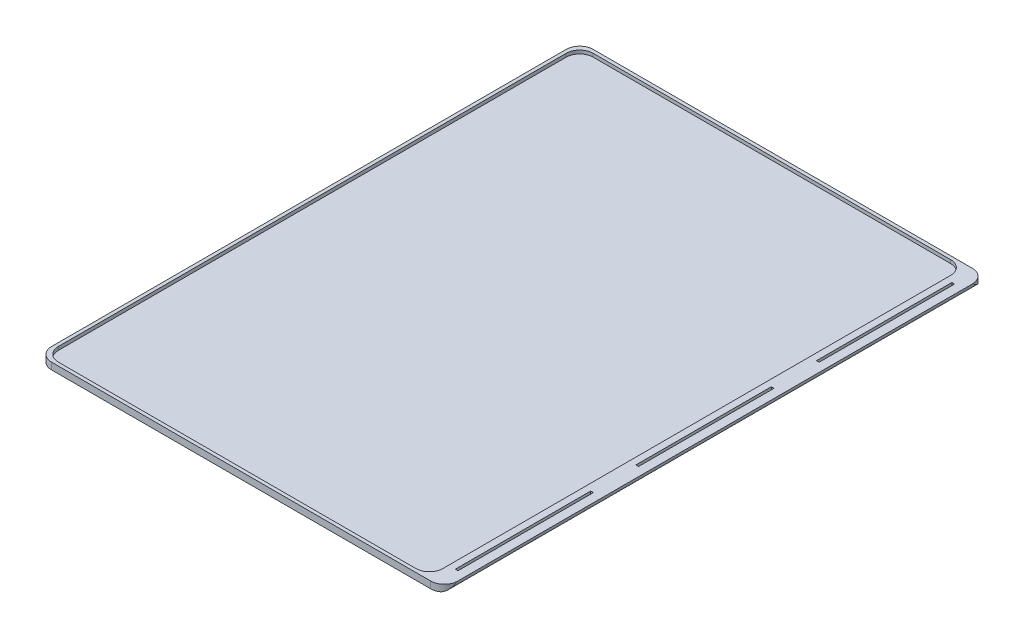
ISO-10303-21;
HEADER;
FILE_DESCRIPTION(('STEP AP214'),'2;1');
FILE_NAME('part.step','',(''),(''),'','','');
FILE_SCHEMA(('AUTOMOTIVE_DESIGN { 1 0 10303 214 1 1 1 1 }'));
ENDSEC;
DATA;
#1=APPLICATION_CONTEXT('core data for automotive mechanical design processes');
#2=APPLICATION_PROTOCOL_DEFINITION('international standard','automotive_design',2000,#1);
#3=PRODUCT_CONTEXT('',#1,'mechanical');
#4=PRODUCT('Part','Part','',(#3));
#5=PRODUCT_RELATED_PRODUCT_CATEGORY('part','',(#4));
#6=PRODUCT_DEFINITION_FORMATION('','',#4);
#7=PRODUCT_DEFINITION_CONTEXT('part definition',#1,'design');
#8=PRODUCT_DEFINITION('design','',#6,#7);
#9=PRODUCT_DEFINITION_SHAPE('','',#8);
#10=(LENGTH_UNIT() NAMED_UNIT(*) SI_UNIT(.MILLI.,.METRE.));
#11=(NAMED_UNIT(*) PLANE_ANGLE_UNIT() SI_UNIT($,.RADIAN.));
#12=(NAMED_UNIT(*) SI_UNIT($,.STERADIAN.) SOLID_ANGLE_UNIT());
#13=UNCERTAINTY_MEASURE_WITH_UNIT(LENGTH_MEASURE(1.E-05),#10,'distance_accuracy_value','');
#14=(GEOMETRIC_REPRESENTATION_CONTEXT(3) GLOBAL_UNCERTAINTY_ASSIGNED_CONTEXT((#13)) GLOBAL_UNIT_ASSIGNED_CONTEXT((#10,
#11,#12)) REPRESENTATION_CONTEXT('',''));
#15=CARTESIAN_POINT('',(0.,0.,0.));
#16=DIRECTION('',(0.,0.,1.));
#17=DIRECTION('',(1.,0.,0.));
#18=AXIS2_PLACEMENT_3D('',#15,#16,#17);
#19=CARTESIAN_POINT('',(-150.,5.,200.));
#20=DIRECTION('',(0.,0.,-1.));
#21=DIRECTION('',(-1.,0.,0.));
#22=AXIS2_PLACEMENT_3D('',#19,#20,#21);
#23=PLANE('',#22);
#24=DIRECTION('',(0.,1.,0.));
#25=VECTOR('',#24,1.);
#26=CARTESIAN_POINT('',(140.,0.,200.));
#27=LINE('',#26,#25);
#28=CARTESIAN_POINT('',(140.,0.,200.));
#29=VERTEX_POINT('',#28);
#30=CARTESIAN_POINT('',(140.,5.,200.));
#31=VERTEX_POINT('',#30);
#32=EDGE_CURVE('E81',#29,#31,#27,.T.);
#33=ORIENTED_EDGE('',*,*,#32,.T.);
#34=DIRECTION('',(1.,0.,0.));
#35=VECTOR('',#34,1.);
#36=CARTESIAN_POINT('',(-150.,5.,200.));
#37=LINE('',#36,#35);
#38=CARTESIAN_POINT('',(-140.,5.,200.));
#39=VERTEX_POINT('',#38);
#40=EDGE_CURVE('E239',#39,#31,#37,.T.);
#41=ORIENTED_EDGE('',*,*,#40,.F.);
#42=DIRECTION('',(0.,-1.,0.));
#43=VECTOR('',#42,1.);
#44=CARTESIAN_POINT('',(-140.,5.,200.));
#45=LINE('',#44,#43);
#46=CARTESIAN_POINT('',(-140.,0.,200.));
#47=VERTEX_POINT('',#46);
#48=EDGE_CURVE('E252',#39,#47,#45,.T.);
#49=ORIENTED_EDGE('',*,*,#48,.T.);
#50=DIRECTION('',(1.,0.,0.));
#51=VECTOR('',#50,1.);
#52=CARTESIAN_POINT('',(-150.,0.,200.));
#53=LINE('',#52,#51);
#54=EDGE_CURVE('E562',#47,#29,#53,.T.);
#55=ORIENTED_EDGE('',*,*,#54,.T.);
#56=EDGE_LOOP('',(#33,#41,#49,#55));
#57=FACE_BOUND('',#56,.T.);
#58=ADVANCED_FACE('F38',(#57),#23,.F.);
#59=CARTESIAN_POINT('',(-150.,5.,-200.));
#60=DIRECTION('',(0.,0.,1.));
#61=DIRECTION('',(1.,0.,0.));
#62=AXIS2_PLACEMENT_3D('',#59,#60,#61);
#63=PLANE('',#62);
#64=DIRECTION('',(-1.,0.,0.));
#65=VECTOR('',#64,1.);
#66=CARTESIAN_POINT('',(-150.,5.,-200.));
#67=LINE('',#66,#65);
#68=CARTESIAN_POINT('',(140.,5.,-200.));
#69=VERTEX_POINT('',#68);
#70=CARTESIAN_POINT('',(-140.,5.,-200.));
#71=VERTEX_POINT('',#70);
#72=EDGE_CURVE('E561',#69,#71,#67,.T.);
#73=ORIENTED_EDGE('',*,*,#72,.F.);
#74=DIRECTION('',(0.,1.,0.));
#75=VECTOR('',#74,1.);
#76=CARTESIAN_POINT('',(140.,0.,-200.));
#77=LINE('',#76,#75);
#78=CARTESIAN_POINT('',(140.,0.,-200.));
#79=VERTEX_POINT('',#78);
#80=EDGE_CURVE('E75',#79,#69,#77,.T.);
#81=ORIENTED_EDGE('',*,*,#80,.F.);
#82=DIRECTION('',(-1.,0.,0.));
#83=VECTOR('',#82,1.);
#84=CARTESIAN_POINT('',(-150.,0.,-200.));
#85=LINE('',#84,#83);
#86=CARTESIAN_POINT('',(-140.,0.,-200.));
#87=VERTEX_POINT('',#86);
#88=EDGE_CURVE('E557',#79,#87,#85,.T.);
#89=ORIENTED_EDGE('',*,*,#88,.T.);
#90=DIRECTION('',(0.,-1.,0.));
#91=VECTOR('',#90,1.);
#92=CARTESIAN_POINT('',(-140.,5.,-200.));
#93=LINE('',#92,#91);
#94=EDGE_CURVE('E379',#87,#71,#93,.F.);
#95=ORIENTED_EDGE('',*,*,#94,.T.);
#96=EDGE_LOOP('',(#73,#81,#89,#95));
#97=FACE_BOUND('',#96,.T.);
#98=ADVANCED_FACE('F311',(#97),#63,.F.);
#99=CARTESIAN_POINT('',(-150.,5.,200.));
#100=DIRECTION('',(1.,0.,0.));
#101=DIRECTION('',(0.,0.,-1.));
#102=AXIS2_PLACEMENT_3D('',#99,#100,#101);
#103=PLANE('',#102);
#104=DIRECTION('',(0.,0.,1.));
#105=VECTOR('',#104,1.);
#106=CARTESIAN_POINT('',(-150.,5.,200.));
#107=LINE('',#106,#105);
#108=CARTESIAN_POINT('',(-150.,5.,-190.));
#109=VERTEX_POINT('',#108);
#110=CARTESIAN_POINT('',(-150.,5.,190.));
#111=VERTEX_POINT('',#110);
#112=EDGE_CURVE('E241',#109,#111,#107,.T.);
#113=ORIENTED_EDGE('',*,*,#112,.F.);
#114=DIRECTION('',(0.,-1.,0.));
#115=VECTOR('',#114,1.);
#116=CARTESIAN_POINT('',(-150.,5.,-190.));
#117=LINE('',#116,#115);
#118=CARTESIAN_POINT('',(-150.,0.,-190.));
#119=VERTEX_POINT('',#118);
#120=EDGE_CURVE('E369',#109,#119,#117,.T.);
#121=ORIENTED_EDGE('',*,*,#120,.T.);
#122=DIRECTION('',(0.,0.,1.));
#123=VECTOR('',#122,1.);
#124=CARTESIAN_POINT('',(-150.,0.,200.));
#125=LINE('',#124,#123);
#126=CARTESIAN_POINT('',(-150.,0.,190.));
#127=VERTEX_POINT('',#126);
#128=EDGE_CURVE('E569',#119,#127,#125,.T.);
#129=ORIENTED_EDGE('',*,*,#128,.T.);
#130=DIRECTION('',(0.,-1.,0.));
#131=VECTOR('',#130,1.);
#132=CARTESIAN_POINT('',(-150.,5.,190.));
#133=LINE('',#132,#131);
#134=EDGE_CURVE('E366',#127,#111,#133,.F.);
#135=ORIENTED_EDGE('',*,*,#134,.T.);
#136=EDGE_LOOP('',(#113,#121,#129,#135));
#137=FACE_BOUND('',#136,.T.);
#138=ADVANCED_FACE('F305',(#137),#103,.F.);
#139=CARTESIAN_POINT('',(0.,5.,0.));
#140=DIRECTION('',(0.,-1.,0.));
#141=DIRECTION('',(0.,0.,-1.));
#142=AXIS2_PLACEMENT_3D('',#139,#140,#141);
#143=PLANE('',#142);
#144=DIRECTION('',(-1.,0.,0.));
#145=VECTOR('',#144,1.);
#146=CARTESIAN_POINT('',(-147.5,5.,-197.5));
#147=LINE('',#146,#145);
#148=CARTESIAN_POINT('',(126.5,5.,-197.5));
#149=VERTEX_POINT('',#148);
#150=CARTESIAN_POINT('',(-137.5,5.,-197.5));
#151=VERTEX_POINT('',#150);
#152=EDGE_CURVE('E408',#149,#151,#147,.T.);
#153=ORIENTED_EDGE('',*,*,#152,.F.);
#154=CARTESIAN_POINT('',(126.5,5.,-187.5));
#155=DIRECTION('',(0.,-1.,0.));
#156=DIRECTION('',(0.,0.,-1.));
#157=AXIS2_PLACEMENT_3D('',#154,#155,#156);
#158=CIRCLE('',#157,10.);
#159=CARTESIAN_POINT('',(136.5,5.,-187.5));
#160=VERTEX_POINT('',#159);
#161=EDGE_CURVE('E264',#149,#160,#158,.T.);
#162=ORIENTED_EDGE('',*,*,#161,.T.);
#163=DIRECTION('',(0.,0.,-1.));
#164=VECTOR('',#163,1.);
#165=CARTESIAN_POINT('',(136.5,5.,197.5));
#166=LINE('',#165,#164);
#167=CARTESIAN_POINT('',(136.5,5.,187.5));
#168=VERTEX_POINT('',#167);
#169=EDGE_CURVE('E592',#168,#160,#166,.T.);
#170=ORIENTED_EDGE('',*,*,#169,.F.);
#171=CARTESIAN_POINT('',(126.5,5.,187.5));
#172=DIRECTION('',(0.,-1.,0.));
#173=DIRECTION('',(0.,0.,-1.));
#174=AXIS2_PLACEMENT_3D('',#171,#172,#173);
#175=CIRCLE('',#174,10.);
#176=CARTESIAN_POINT('',(126.5,5.,197.5));
#177=VERTEX_POINT('',#176);
#178=EDGE_CURVE('E227',#168,#177,#175,.T.);
#179=ORIENTED_EDGE('',*,*,#178,.T.);
#180=DIRECTION('',(1.,0.,0.));
#181=VECTOR('',#180,1.);
#182=CARTESIAN_POINT('',(-147.5,5.,197.5));
#183=LINE('',#182,#181);
#184=CARTESIAN_POINT('',(-137.5,5.,197.5));
#185=VERTEX_POINT('',#184);
#186=EDGE_CURVE('E392',#185,#177,#183,.T.);
#187=ORIENTED_EDGE('',*,*,#186,.F.);
#188=CARTESIAN_POINT('',(-137.5,5.,187.5));
#189=DIRECTION('',(0.,-1.,0.));
#190=DIRECTION('',(0.,0.,-1.));
#191=AXIS2_PLACEMENT_3D('',#188,#189,#190);
#192=CIRCLE('',#191,10.);
#193=CARTESIAN_POINT('',(-147.5,5.,187.5));
#194=VERTEX_POINT('',#193);
#195=EDGE_CURVE('E247',#185,#194,#192,.T.);
#196=ORIENTED_EDGE('',*,*,#195,.T.);
#197=DIRECTION('',(0.,0.,1.));
#198=VECTOR('',#197,1.);
#199=CARTESIAN_POINT('',(-147.5,5.,197.5));
#200=LINE('',#199,#198);
#201=CARTESIAN_POINT('',(-147.5,5.,-187.5));
#202=VERTEX_POINT('',#201);
#203=EDGE_CURVE('E401',#202,#194,#200,.T.);
#204=ORIENTED_EDGE('',*,*,#203,.F.);
#205=CARTESIAN_POINT('',(-137.5,5.,-187.5));
#206=DIRECTION('',(0.,-1.,0.));
#207=DIRECTION('',(0.,0.,-1.));
#208=AXIS2_PLACEMENT_3D('',#205,#206,#207);
#209=CIRCLE('',#208,10.);
#210=EDGE_CURVE('E259',#202,#151,#209,.T.);
#211=ORIENTED_EDGE('',*,*,#210,.T.);
#212=EDGE_LOOP('',(#153,#162,#170,#179,#187,#196,#204,#211));
#213=FACE_BOUND('',#212,.T.);
#214=DIRECTION('',(-1.,0.,0.));
#215=VECTOR('',#214,1.);
#216=CARTESIAN_POINT('',(0.,5.,-83.3333333333333));
#217=LINE('',#216,#215);
#218=CARTESIAN_POINT('',(143.5,5.,-83.3333333333333));
#219=VERTEX_POINT('',#218);
#220=CARTESIAN_POINT('',(141.5,5.,-83.3333333333333));
#221=VERTEX_POINT('',#220);
#222=EDGE_CURVE('E537',#219,#221,#217,.T.);
#223=ORIENTED_EDGE('',*,*,#222,.T.);
#224=DIRECTION('',(0.,0.,-1.));
#225=VECTOR('',#224,1.);
#226=CARTESIAN_POINT('',(141.5,5.,0.));
#227=LINE('',#226,#225);
#228=CARTESIAN_POINT('',(141.5,5.,-183.333333333333));
#229=VERTEX_POINT('',#228);
#230=EDGE_CURVE('E549',#221,#229,#227,.T.);
#231=ORIENTED_EDGE('',*,*,#230,.T.);
#232=DIRECTION('',(1.,0.,0.));
#233=VECTOR('',#232,1.);
#234=CARTESIAN_POINT('',(0.,5.,-183.333333333333));
#235=LINE('',#234,#233);
#236=CARTESIAN_POINT('',(143.5,5.,-183.333333333333));
#237=VERTEX_POINT('',#236);
#238=EDGE_CURVE('E545',#229,#237,#235,.T.);
#239=ORIENTED_EDGE('',*,*,#238,.T.);
#240=DIRECTION('',(0.,0.,1.));
#241=VECTOR('',#240,1.);
#242=CARTESIAN_POINT('',(143.5,5.,0.));
#243=LINE('',#242,#241);
#244=EDGE_CURVE('E541',#237,#219,#243,.T.);
#245=ORIENTED_EDGE('',*,*,#244,.T.);
#246=EDGE_LOOP('',(#223,#231,#239,#245));
#247=FACE_BOUND('',#246,.T.);
#248=DIRECTION('',(1.,0.,0.));
#249=VECTOR('',#248,1.);
#250=CARTESIAN_POINT('',(0.,5.,83.3333333333333));
#251=LINE('',#250,#249);
#252=CARTESIAN_POINT('',(141.5,5.,83.3333333333333));
#253=VERTEX_POINT('',#252);
#254=CARTESIAN_POINT('',(143.5,5.,83.3333333333333));
#255=VERTEX_POINT('',#254);
#256=EDGE_CURVE('E521',#253,#255,#251,.T.);
#257=ORIENTED_EDGE('',*,*,#256,.T.);
#258=DIRECTION('',(0.,0.,1.));
#259=VECTOR('',#258,1.);
#260=CARTESIAN_POINT('',(143.5,5.,0.));
#261=LINE('',#260,#259);
#262=CARTESIAN_POINT('',(143.5,5.,183.333333333333));
#263=VERTEX_POINT('',#262);
#264=EDGE_CURVE('E533',#255,#263,#261,.T.);
#265=ORIENTED_EDGE('',*,*,#264,.T.);
#266=DIRECTION('',(-1.,0.,0.));
#267=VECTOR('',#266,1.);
#268=CARTESIAN_POINT('',(0.,5.,183.333333333333));
#269=LINE('',#268,#267);
#270=CARTESIAN_POINT('',(141.5,5.,183.333333333333));
#271=VERTEX_POINT('',#270);
#272=EDGE_CURVE('E529',#263,#271,#269,.T.);
#273=ORIENTED_EDGE('',*,*,#272,.T.);
#274=DIRECTION('',(0.,0.,-1.));
#275=VECTOR('',#274,1.);
#276=CARTESIAN_POINT('',(141.5,5.,0.));
#277=LINE('',#276,#275);
#278=EDGE_CURVE('E525',#271,#253,#277,.T.);
#279=ORIENTED_EDGE('',*,*,#278,.T.);
#280=EDGE_LOOP('',(#257,#265,#273,#279));
#281=FACE_BOUND('',#280,.T.);
#282=DIRECTION('',(1.,0.,0.));
#283=VECTOR('',#282,1.);
#284=CARTESIAN_POINT('',(0.,5.,-50.));
#285=LINE('',#284,#283);
#286=CARTESIAN_POINT('',(141.5,5.,-50.));
#287=VERTEX_POINT('',#286);
#288=CARTESIAN_POINT('',(143.5,5.,-50.));
#289=VERTEX_POINT('',#288);
#290=EDGE_CURVE('E495',#287,#289,#285,.T.);
#291=ORIENTED_EDGE('',*,*,#290,.T.);
#292=DIRECTION('',(0.,0.,1.));
#293=VECTOR('',#292,1.);
#294=CARTESIAN_POINT('',(143.5,5.,0.));
#295=LINE('',#294,#293);
#296=CARTESIAN_POINT('',(143.5,5.,50.));
#297=VERTEX_POINT('',#296);
#298=EDGE_CURVE('E517',#289,#297,#295,.T.);
#299=ORIENTED_EDGE('',*,*,#298,.T.);
#300=DIRECTION('',(-1.,0.,0.));
#301=VECTOR('',#300,1.);
#302=CARTESIAN_POINT('',(0.,5.,50.));
#303=LINE('',#302,#301);
#304=CARTESIAN_POINT('',(141.5,5.,50.));
#305=VERTEX_POINT('',#304);
#306=EDGE_CURVE('E513',#297,#305,#303,.T.);
#307=ORIENTED_EDGE('',*,*,#306,.T.);
#308=DIRECTION('',(0.,0.,-1.));
#309=VECTOR('',#308,1.);
#310=CARTESIAN_POINT('',(141.5,5.,0.));
#311=LINE('',#310,#309);
#312=EDGE_CURVE('E509',#305,#287,#311,.T.);
#313=ORIENTED_EDGE('',*,*,#312,.T.);
#314=EDGE_LOOP('',(#291,#299,#307,#313));
#315=FACE_BOUND('',#314,.T.);
#316=DIRECTION('',(0.,0.,-1.));
#317=VECTOR('',#316,1.);
#318=CARTESIAN_POINT('',(150.,5.,200.));
#319=LINE('',#318,#317);
#320=CARTESIAN_POINT('',(150.,5.,190.));
#321=VERTEX_POINT('',#320);
#322=CARTESIAN_POINT('',(150.,5.,-190.));
#323=VERTEX_POINT('',#322);
#324=EDGE_CURVE('E558',#321,#323,#319,.T.);
#325=ORIENTED_EDGE('',*,*,#324,.T.);
#326=CARTESIAN_POINT('',(140.,5.,-190.));
#327=DIRECTION('',(0.,1.,0.));
#328=DIRECTION('',(0.,0.,1.));
#329=AXIS2_PLACEMENT_3D('',#326,#327,#328);
#330=CIRCLE('',#329,10.);
#331=EDGE_CURVE('E42',#69,#323,#330,.F.);
#332=ORIENTED_EDGE('',*,*,#331,.F.);
#333=ORIENTED_EDGE('',*,*,#72,.T.);
#334=CARTESIAN_POINT('',(-140.,5.,-190.));
#335=DIRECTION('',(0.,-1.,0.));
#336=DIRECTION('',(0.,0.,-1.));
#337=AXIS2_PLACEMENT_3D('',#334,#335,#336);
#338=CIRCLE('',#337,10.);
#339=EDGE_CURVE('E246',#71,#109,#338,.F.);
#340=ORIENTED_EDGE('',*,*,#339,.T.);
#341=ORIENTED_EDGE('',*,*,#112,.T.);
#342=CARTESIAN_POINT('',(-140.,5.,190.));
#343=DIRECTION('',(0.,-1.,0.));
#344=DIRECTION('',(0.,0.,-1.));
#345=AXIS2_PLACEMENT_3D('',#342,#343,#344);
#346=CIRCLE('',#345,10.);
#347=EDGE_CURVE('E234',#111,#39,#346,.F.);
#348=ORIENTED_EDGE('',*,*,#347,.T.);
#349=ORIENTED_EDGE('',*,*,#40,.T.);
#350=CARTESIAN_POINT('',(140.,5.,190.));
#351=DIRECTION('',(0.,1.,0.));
#352=DIRECTION('',(0.,0.,1.));
#353=AXIS2_PLACEMENT_3D('',#350,#351,#352);
#354=CIRCLE('',#353,10.);
#355=EDGE_CURVE('E610',#321,#31,#354,.F.);
#356=ORIENTED_EDGE('',*,*,#355,.F.);
#357=EDGE_LOOP('',(#325,#332,#333,#340,#341,#348,#349,#356));
#358=FACE_BOUND('',#357,.T.);
#359=ADVANCED_FACE('F237',(#213,#247,#281,#315,#358),#143,.F.);
#360=CARTESIAN_POINT('',(0.,0.,0.));
#361=DIRECTION('',(0.,-1.,0.));
#362=DIRECTION('',(0.,0.,-1.));
#363=AXIS2_PLACEMENT_3D('',#360,#361,#362);
#364=PLANE('',#363);
#365=CARTESIAN_POINT('',(140.,0.,-190.));
#366=DIRECTION('',(0.,-1.,0.));
#367=DIRECTION('',(0.,0.,-1.));
#368=AXIS2_PLACEMENT_3D('',#365,#366,#367);
#369=CIRCLE('',#368,10.);
#370=CARTESIAN_POINT('',(145.,0.,-198.660254037844));
#371=VERTEX_POINT('',#370);
#372=EDGE_CURVE('E605',#79,#371,#369,.T.);
#373=ORIENTED_EDGE('',*,*,#372,.T.);
#374=DIRECTION('',(0.,0.,1.));
#375=VECTOR('',#374,1.);
#376=CARTESIAN_POINT('',(145.,0.,-207.071067811865));
#377=LINE('',#376,#375);
#378=CARTESIAN_POINT('',(145.,0.,198.660254037844));
#379=VERTEX_POINT('',#378);
#380=EDGE_CURVE('E553',#371,#379,#377,.T.);
#381=ORIENTED_EDGE('',*,*,#380,.T.);
#382=CARTESIAN_POINT('',(140.,0.,190.));
#383=DIRECTION('',(0.,-1.,0.));
#384=DIRECTION('',(0.,0.,1.));
#385=AXIS2_PLACEMENT_3D('',#382,#383,#384);
#386=CIRCLE('',#385,10.);
#387=EDGE_CURVE('E57',#379,#29,#386,.T.);
#388=ORIENTED_EDGE('',*,*,#387,.T.);
#389=ORIENTED_EDGE('',*,*,#54,.F.);
#390=CARTESIAN_POINT('',(-140.,0.,190.));
#391=DIRECTION('',(0.,-1.,0.));
#392=DIRECTION('',(0.,0.,-1.));
#393=AXIS2_PLACEMENT_3D('',#390,#391,#392);
#394=CIRCLE('',#393,10.);
#395=EDGE_CURVE('E257',#47,#127,#394,.T.);
#396=ORIENTED_EDGE('',*,*,#395,.T.);
#397=ORIENTED_EDGE('',*,*,#128,.F.);
#398=CARTESIAN_POINT('',(-140.,0.,-190.));
#399=DIRECTION('',(0.,-1.,0.));
#400=DIRECTION('',(0.,0.,-1.));
#401=AXIS2_PLACEMENT_3D('',#398,#399,#400);
#402=CIRCLE('',#401,10.);
#403=EDGE_CURVE('E375',#119,#87,#402,.T.);
#404=ORIENTED_EDGE('',*,*,#403,.T.);
#405=ORIENTED_EDGE('',*,*,#88,.F.);
#406=EDGE_LOOP('',(#373,#381,#388,#389,#396,#397,#404,#405));
#407=FACE_BOUND('',#406,.T.);
#408=DIRECTION('',(0.,0.,1.));
#409=VECTOR('',#408,1.);
#410=CARTESIAN_POINT('',(141.5,0.,-83.3333333333333));
#411=LINE('',#410,#409);
#412=CARTESIAN_POINT('',(141.5,0.,-183.333333333333));
#413=VERTEX_POINT('',#412);
#414=CARTESIAN_POINT('',(141.5,0.,-83.3333333333333));
#415=VERTEX_POINT('',#414);
#416=EDGE_CURVE('E445',#413,#415,#411,.T.);
#417=ORIENTED_EDGE('',*,*,#416,.T.);
#418=DIRECTION('',(1.,0.,0.));
#419=VECTOR('',#418,1.);
#420=CARTESIAN_POINT('',(143.5,0.,-83.3333333333333));
#421=LINE('',#420,#419);
#422=CARTESIAN_POINT('',(143.5,0.,-83.3333333333333));
#423=VERTEX_POINT('',#422);
#424=EDGE_CURVE('E449',#415,#423,#421,.T.);
#425=ORIENTED_EDGE('',*,*,#424,.T.);
#426=DIRECTION('',(0.,0.,-1.));
#427=VECTOR('',#426,1.);
#428=CARTESIAN_POINT('',(143.5,0.,-83.3333333333333));
#429=LINE('',#428,#427);
#430=CARTESIAN_POINT('',(143.5,0.,-183.333333333333));
#431=VERTEX_POINT('',#430);
#432=EDGE_CURVE('E453',#423,#431,#429,.T.);
#433=ORIENTED_EDGE('',*,*,#432,.T.);
#434=DIRECTION('',(-1.,0.,0.));
#435=VECTOR('',#434,1.);
#436=CARTESIAN_POINT('',(143.5,0.,-183.333333333333));
#437=LINE('',#436,#435);
#438=EDGE_CURVE('E457',#431,#413,#437,.T.);
#439=ORIENTED_EDGE('',*,*,#438,.T.);
#440=EDGE_LOOP('',(#417,#425,#433,#439));
#441=FACE_BOUND('',#440,.T.);
#442=DIRECTION('',(0.,0.,-1.));
#443=VECTOR('',#442,1.);
#444=CARTESIAN_POINT('',(143.5,0.,83.3333333333333));
#445=LINE('',#444,#443);
#446=CARTESIAN_POINT('',(143.5,0.,183.333333333333));
#447=VERTEX_POINT('',#446);
#448=CARTESIAN_POINT('',(143.5,0.,83.3333333333333));
#449=VERTEX_POINT('',#448);
#450=EDGE_CURVE('E412',#447,#449,#445,.T.);
#451=ORIENTED_EDGE('',*,*,#450,.T.);
#452=DIRECTION('',(-1.,0.,0.));
#453=VECTOR('',#452,1.);
#454=CARTESIAN_POINT('',(143.5,0.,83.3333333333333));
#455=LINE('',#454,#453);
#456=CARTESIAN_POINT('',(141.5,0.,83.3333333333333));
#457=VERTEX_POINT('',#456);
#458=EDGE_CURVE('E416',#449,#457,#455,.T.);
#459=ORIENTED_EDGE('',*,*,#458,.T.);
#460=DIRECTION('',(0.,0.,1.));
#461=VECTOR('',#460,1.);
#462=CARTESIAN_POINT('',(141.5,0.,83.3333333333333));
#463=LINE('',#462,#461);
#464=CARTESIAN_POINT('',(141.5,0.,183.333333333333));
#465=VERTEX_POINT('',#464);
#466=EDGE_CURVE('E421',#457,#465,#463,.T.);
#467=ORIENTED_EDGE('',*,*,#466,.T.);
#468=DIRECTION('',(1.,0.,0.));
#469=VECTOR('',#468,1.);
#470=CARTESIAN_POINT('',(143.5,0.,183.333333333333));
#471=LINE('',#470,#469);
#472=EDGE_CURVE('E425',#465,#447,#471,.T.);
#473=ORIENTED_EDGE('',*,*,#472,.T.);
#474=EDGE_LOOP('',(#451,#459,#467,#473));
#475=FACE_BOUND('',#474,.T.);
#476=DIRECTION('',(0.,0.,-1.));
#477=VECTOR('',#476,1.);
#478=CARTESIAN_POINT('',(143.5,0.,50.));
#479=LINE('',#478,#477);
#480=CARTESIAN_POINT('',(143.5,0.,50.));
#481=VERTEX_POINT('',#480);
#482=CARTESIAN_POINT('',(143.5,0.,-50.));
#483=VERTEX_POINT('',#482);
#484=EDGE_CURVE('E434',#481,#483,#479,.T.);
#485=ORIENTED_EDGE('',*,*,#484,.T.);
#486=DIRECTION('',(-1.,0.,0.));
#487=VECTOR('',#486,1.);
#488=CARTESIAN_POINT('',(141.5,0.,-50.));
#489=LINE('',#488,#487);
#490=CARTESIAN_POINT('',(141.5,0.,-50.));
#491=VERTEX_POINT('',#490);
#492=EDGE_CURVE('E478',#483,#491,#489,.T.);
#493=ORIENTED_EDGE('',*,*,#492,.T.);
#494=DIRECTION('',(0.,0.,1.));
#495=VECTOR('',#494,1.);
#496=CARTESIAN_POINT('',(141.5,0.,50.));
#497=LINE('',#496,#495);
#498=CARTESIAN_POINT('',(141.5,0.,50.));
#499=VERTEX_POINT('',#498);
#500=EDGE_CURVE('E482',#491,#499,#497,.T.);
#501=ORIENTED_EDGE('',*,*,#500,.T.);
#502=DIRECTION('',(1.,0.,0.));
#503=VECTOR('',#502,1.);
#504=CARTESIAN_POINT('',(141.5,0.,50.));
#505=LINE('',#504,#503);
#506=EDGE_CURVE('E486',#499,#481,#505,.T.);
#507=ORIENTED_EDGE('',*,*,#506,.T.);
#508=EDGE_LOOP('',(#485,#493,#501,#507));
#509=FACE_BOUND('',#508,.T.);
#510=ADVANCED_FACE('F299',(#407,#441,#475,#509),#364,.T.);
#511=CARTESIAN_POINT('',(145.,5.,-207.071067811865));
#512=DIRECTION('',(0.,0.,1.));
#513=DIRECTION('',(1.,0.,0.));
#514=AXIS2_PLACEMENT_3D('',#511,#512,#513);
#515=CYLINDRICAL_SURFACE('',#514,5.);
#516=ORIENTED_EDGE('',*,*,#380,.F.);
#517=CARTESIAN_POINT('',(145.,0.,-198.660254037844));
#518=CARTESIAN_POINT('',(145.093609803985,2.82900776375615E-07,-198.606212007458));
#519=CARTESIAN_POINT('',(145.186311264449,0.00262887455136164,-198.550662954952));
#520=CARTESIAN_POINT('',(145.36964138603,0.0128372529330054,-198.436740132321));
#521=CARTESIAN_POINT('',(145.460270761163,0.0204153066888389,-198.378367357499));
#522=CARTESIAN_POINT('',(145.728272440389,0.0500643550123252,-198.199566980871));
#523=CARTESIAN_POINT('',(145.902274960932,0.0790536521328677,-198.075158543872));
#524=CARTESIAN_POINT('',(146.237507498331,0.152561857671383,-197.819044434756));
#525=CARTESIAN_POINT('',(146.398876166368,0.19686998153993,-197.687457245508));
#526=CARTESIAN_POINT('',(146.710806798773,0.298927164585177,-197.416721400865));
#527=CARTESIAN_POINT('',(146.861360705299,0.356686112509046,-197.277567240372));
#528=CARTESIAN_POINT('',(147.178776996639,0.495735220903303,-196.965888284656));
#529=CARTESIAN_POINT('',(147.343298693685,0.579411379535737,-196.792048586878));
#530=CARTESIAN_POINT('',(147.656318748926,0.760113724235766,-196.437141735185));
#531=CARTESIAN_POINT('',(147.804816764136,0.857140195964682,-196.256074426678));
#532=CARTESIAN_POINT('',(148.086845991203,1.06274155527054,-195.887032941535));
#533=CARTESIAN_POINT('',(148.220288543533,1.17137818980302,-195.699025709427));
#534=CARTESIAN_POINT('',(148.471670665722,1.39776170220441,-195.31816530131));
#535=CARTESIAN_POINT('',(148.58960569155,1.51551123435892,-195.125310724559));
#536=CARTESIAN_POINT('',(148.855158632255,1.80766922049536,-194.656735938183));
#537=CARTESIAN_POINT('',(148.995441039513,1.98570315103982,-194.379102363274));
#538=CARTESIAN_POINT('',(149.247514860227,2.35270007359222,-193.818126441812));
#539=CARTESIAN_POINT('',(149.35929348694,2.54166792406395,-193.534781594477));
#540=CARTESIAN_POINT('',(149.555241292463,2.92720972137607,-192.964477925597));
#541=CARTESIAN_POINT('',(149.639451802214,3.12377178346134,-192.677525190093));
#542=CARTESIAN_POINT('',(149.781306053329,3.52222740575528,-192.100985491777));
#543=CARTESIAN_POINT('',(149.838961233289,3.72411863075196,-191.811399718053));
#544=CARTESIAN_POINT('',(149.922137945499,4.10291579740512,-191.27090816212));
#545=CARTESIAN_POINT('',(149.951008549531,4.27940080098434,-191.02021175129));
#546=CARTESIAN_POINT('',(149.989717957205,4.63342093770946,-190.518432616014));
#547=CARTESIAN_POINT('',(149.999576815702,4.81095476590358,-190.267350578567));
#548=CARTESIAN_POINT('',(149.999995554205,4.99230201707942,-190.010886592107));
#549=CARTESIAN_POINT('',(149.999999998529,4.99615102023748,-190.005443279649));
#550=CARTESIAN_POINT('',(150.,5.,-190.));
#551=B_SPLINE_CURVE_WITH_KNOTS('',3,(#517,#518,#519,#520,#521,#522,#523,#524,#525,#526,#527,
#528,#529,#530,#531,#532,#533,#534,#535,#536,#537,#538,#539,#540,#541,#542,#543,#544,#545,#546,
#547,#548,#549,#550),.UNSPECIFIED.,.F.,.F.,(4,2,2,2,2,2,2,2,2,2,2,2,2,2,2,2,4),(0.,
0.324164501699216,0.648215563170107,1.29453690515239,1.93229735394234,2.57052815854182,
3.3300899276727,4.08966795194073,4.8535082233837,5.61757181965431,6.69122947966733,
7.7653679365691,8.83788855857119,9.90994676377598,10.8332249647611,11.7555286965104,
11.7755287009549),.UNSPECIFIED.);
#552=EDGE_CURVE('E11',#371,#323,#551,.T.);
#553=ORIENTED_EDGE('',*,*,#552,.T.);
#554=ORIENTED_EDGE('',*,*,#324,.F.);
#555=CARTESIAN_POINT('',(145.,0.,198.660254037844));
#556=CARTESIAN_POINT('',(145.093609803985,2.82900775810247E-07,198.606212007458));
#557=CARTESIAN_POINT('',(145.186311264449,0.00262887455136094,198.550662954952));
#558=CARTESIAN_POINT('',(145.36964138603,0.0128372529330039,198.436740132321));
#559=CARTESIAN_POINT('',(145.460270761163,0.020415306688837,198.378367357499));
#560=CARTESIAN_POINT('',(145.728272440389,0.0500643550123212,198.199566980871));
#561=CARTESIAN_POINT('',(145.902274960932,0.0790536521328612,198.075158543872));
#562=CARTESIAN_POINT('',(146.237507498331,0.152561857671376,197.819044434756));
#563=CARTESIAN_POINT('',(146.398876166368,0.196869981539926,197.687457245508));
#564=CARTESIAN_POINT('',(146.710806798773,0.298927164585177,197.416721400865));
#565=CARTESIAN_POINT('',(146.861360705299,0.356686112509047,197.277567240372));
#566=CARTESIAN_POINT('',(147.178776996639,0.495735220903303,196.965888284656));
#567=CARTESIAN_POINT('',(147.343298693685,0.579411379535736,196.792048586878));
#568=CARTESIAN_POINT('',(147.656318748926,0.760113724235769,196.437141735185));
#569=CARTESIAN_POINT('',(147.804816764136,0.857140195964692,196.256074426678));
#570=CARTESIAN_POINT('',(148.086845991203,1.06274155527056,195.887032941535));
#571=CARTESIAN_POINT('',(148.220288543533,1.17137818980304,195.699025709427));
#572=CARTESIAN_POINT('',(148.471670665723,1.39776170220443,195.31816530131));
#573=CARTESIAN_POINT('',(148.58960569155,1.51551123435894,195.125310724559));
#574=CARTESIAN_POINT('',(148.855158632255,1.80766922049539,194.656735938183));
#575=CARTESIAN_POINT('',(148.995441039513,1.98570315103984,194.379102363274));
#576=CARTESIAN_POINT('',(149.247514860227,2.35270007359223,193.818126441812));
#577=CARTESIAN_POINT('',(149.35929348694,2.54166792406395,193.534781594477));
#578=CARTESIAN_POINT('',(149.555241292463,2.92720972137608,192.964477925597));
#579=CARTESIAN_POINT('',(149.639451802214,3.12377178346135,192.677525190093));
#580=CARTESIAN_POINT('',(149.781306053329,3.52222740575528,192.100985491777));
#581=CARTESIAN_POINT('',(149.838961233289,3.72411863075193,191.811399718053));
#582=CARTESIAN_POINT('',(149.922137945499,4.10291579740515,191.27090816212));
#583=CARTESIAN_POINT('',(149.951008549531,4.27940080098444,191.02021175129));
#584=CARTESIAN_POINT('',(149.989717957205,4.63342093770928,190.518432616014));
#585=CARTESIAN_POINT('',(149.999576815702,4.81095476590306,190.267350578566));
#586=CARTESIAN_POINT('',(149.999995554205,4.9923020170794,190.010886592107));
#587=CARTESIAN_POINT('',(149.999999998529,4.99615102023747,190.00544327965));
#588=CARTESIAN_POINT('',(150.,5.,190.));
#589=B_SPLINE_CURVE_WITH_KNOTS('',3,(#555,#556,#557,#558,#559,#560,#561,#562,#563,#564,#565,
#566,#567,#568,#569,#570,#571,#572,#573,#574,#575,#576,#577,#578,#579,#580,#581,#582,#583,#584,
#585,#586,#587,#588),.UNSPECIFIED.,.F.,.F.,(4,2,2,2,2,2,2,2,2,2,2,2,2,2,2,2,4),(0.,
0.324164501699178,0.648215563170045,1.29453690515235,1.93229735394234,2.57052815854182,
3.3300899276727,4.08966795194073,4.85350822338374,5.61757181965434,6.69122947966736,
7.7653679365691,8.83788855857121,9.90994676377603,10.833224964761,11.7555286965102,
11.7755287009547),.UNSPECIFIED.);
#590=EDGE_CURVE('E49',#321,#379,#589,.F.);
#591=ORIENTED_EDGE('',*,*,#590,.T.);
#592=EDGE_LOOP('',(#516,#553,#554,#591));
#593=FACE_BOUND('',#592,.T.);
#594=ADVANCED_FACE('F293',(#593),#515,.T.);
#595=CARTESIAN_POINT('',(143.5,0.,50.));
#596=DIRECTION('',(1.,0.,0.));
#597=DIRECTION('',(0.,0.,-1.));
#598=AXIS2_PLACEMENT_3D('',#595,#596,#597);
#599=PLANE('',#598);
#600=DIRECTION('',(0.,1.,0.));
#601=VECTOR('',#600,1.);
#602=CARTESIAN_POINT('',(143.5,0.,-50.));
#603=LINE('',#602,#601);
#604=EDGE_CURVE('E490',#483,#289,#603,.T.);
#605=ORIENTED_EDGE('',*,*,#604,.F.);
#606=ORIENTED_EDGE('',*,*,#484,.F.);
#607=DIRECTION('',(0.,1.,0.));
#608=VECTOR('',#607,1.);
#609=CARTESIAN_POINT('',(143.5,0.,50.));
#610=LINE('',#609,#608);
#611=EDGE_CURVE('E491',#481,#297,#610,.T.);
#612=ORIENTED_EDGE('',*,*,#611,.T.);
#613=ORIENTED_EDGE('',*,*,#298,.F.);
#614=EDGE_LOOP('',(#605,#606,#612,#613));
#615=FACE_BOUND('',#614,.T.);
#616=ADVANCED_FACE('F298',(#615),#599,.F.);
#617=CARTESIAN_POINT('',(141.5,0.,50.));
#618=DIRECTION('',(0.,0.,1.));
#619=DIRECTION('',(1.,0.,0.));
#620=AXIS2_PLACEMENT_3D('',#617,#618,#619);
#621=PLANE('',#620);
#622=ORIENTED_EDGE('',*,*,#611,.F.);
#623=ORIENTED_EDGE('',*,*,#506,.F.);
#624=DIRECTION('',(0.,1.,0.));
#625=VECTOR('',#624,1.);
#626=CARTESIAN_POINT('',(141.5,0.,50.));
#627=LINE('',#626,#625);
#628=EDGE_CURVE('E496',#499,#305,#627,.T.);
#629=ORIENTED_EDGE('',*,*,#628,.T.);
#630=ORIENTED_EDGE('',*,*,#306,.F.);
#631=EDGE_LOOP('',(#622,#623,#629,#630));
#632=FACE_BOUND('',#631,.T.);
#633=ADVANCED_FACE('F673',(#632),#621,.F.);
#634=CARTESIAN_POINT('',(141.5,0.,50.));
#635=DIRECTION('',(-1.,0.,0.));
#636=DIRECTION('',(0.,0.,1.));
#637=AXIS2_PLACEMENT_3D('',#634,#635,#636);
#638=PLANE('',#637);
#639=ORIENTED_EDGE('',*,*,#628,.F.);
#640=ORIENTED_EDGE('',*,*,#500,.F.);
#641=DIRECTION('',(0.,1.,0.));
#642=VECTOR('',#641,1.);
#643=CARTESIAN_POINT('',(141.5,0.,-50.));
#644=LINE('',#643,#642);
#645=EDGE_CURVE('E500',#491,#287,#644,.T.);
#646=ORIENTED_EDGE('',*,*,#645,.T.);
#647=ORIENTED_EDGE('',*,*,#312,.F.);
#648=EDGE_LOOP('',(#639,#640,#646,#647));
#649=FACE_BOUND('',#648,.T.);
#650=ADVANCED_FACE('F679',(#649),#638,.F.);
#651=CARTESIAN_POINT('',(141.5,0.,-50.));
#652=DIRECTION('',(0.,0.,-1.));
#653=DIRECTION('',(-1.,0.,0.));
#654=AXIS2_PLACEMENT_3D('',#651,#652,#653);
#655=PLANE('',#654);
#656=ORIENTED_EDGE('',*,*,#645,.F.);
#657=ORIENTED_EDGE('',*,*,#492,.F.);
#658=ORIENTED_EDGE('',*,*,#604,.T.);
#659=ORIENTED_EDGE('',*,*,#290,.F.);
#660=EDGE_LOOP('',(#656,#657,#658,#659));
#661=FACE_BOUND('',#660,.T.);
#662=ADVANCED_FACE('F687',(#661),#655,.F.);
#663=CARTESIAN_POINT('',(143.5,0.,83.3333333333333));
#664=DIRECTION('',(1.,0.,0.));
#665=DIRECTION('',(0.,0.,-1.));
#666=AXIS2_PLACEMENT_3D('',#663,#664,#665);
#667=PLANE('',#666);
#668=DIRECTION('',(0.,1.,0.));
#669=VECTOR('',#668,1.);
#670=CARTESIAN_POINT('',(143.5,0.,83.3333333333333));
#671=LINE('',#670,#669);
#672=EDGE_CURVE('E429',#449,#255,#671,.T.);
#673=ORIENTED_EDGE('',*,*,#672,.F.);
#674=ORIENTED_EDGE('',*,*,#450,.F.);
#675=DIRECTION('',(0.,1.,0.));
#676=VECTOR('',#675,1.);
#677=CARTESIAN_POINT('',(143.5,0.,183.333333333333));
#678=LINE('',#677,#676);
#679=EDGE_CURVE('E430',#447,#263,#678,.T.);
#680=ORIENTED_EDGE('',*,*,#679,.T.);
#681=ORIENTED_EDGE('',*,*,#264,.F.);
#682=EDGE_LOOP('',(#673,#674,#680,#681));
#683=FACE_BOUND('',#682,.T.);
#684=ADVANCED_FACE('F695',(#683),#667,.F.);
#685=CARTESIAN_POINT('',(143.5,0.,183.333333333333));
#686=DIRECTION('',(0.,0.,1.));
#687=DIRECTION('',(1.,0.,0.));
#688=AXIS2_PLACEMENT_3D('',#685,#686,#687);
#689=PLANE('',#688);
#690=ORIENTED_EDGE('',*,*,#679,.F.);
#691=ORIENTED_EDGE('',*,*,#472,.F.);
#692=DIRECTION('',(0.,1.,0.));
#693=VECTOR('',#692,1.);
#694=CARTESIAN_POINT('',(141.5,0.,183.333333333333));
#695=LINE('',#694,#693);
#696=EDGE_CURVE('E435',#465,#271,#695,.T.);
#697=ORIENTED_EDGE('',*,*,#696,.T.);
#698=ORIENTED_EDGE('',*,*,#272,.F.);
#699=EDGE_LOOP('',(#690,#691,#697,#698));
#700=FACE_BOUND('',#699,.T.);
#701=ADVANCED_FACE('F702',(#700),#689,.F.);
#702=CARTESIAN_POINT('',(141.5,0.,83.3333333333333));
#703=DIRECTION('',(-1.,0.,0.));
#704=DIRECTION('',(0.,0.,1.));
#705=AXIS2_PLACEMENT_3D('',#702,#703,#704);
#706=PLANE('',#705);
#707=ORIENTED_EDGE('',*,*,#696,.F.);
#708=ORIENTED_EDGE('',*,*,#466,.F.);
#709=DIRECTION('',(0.,1.,0.));
#710=VECTOR('',#709,1.);
#711=CARTESIAN_POINT('',(141.5,0.,83.3333333333333));
#712=LINE('',#711,#710);
#713=EDGE_CURVE('E439',#457,#253,#712,.T.);
#714=ORIENTED_EDGE('',*,*,#713,.T.);
#715=ORIENTED_EDGE('',*,*,#278,.F.);
#716=EDGE_LOOP('',(#707,#708,#714,#715));
#717=FACE_BOUND('',#716,.T.);
#718=ADVANCED_FACE('F710',(#717),#706,.F.);
#719=CARTESIAN_POINT('',(143.5,0.,83.3333333333333));
#720=DIRECTION('',(0.,0.,-1.));
#721=DIRECTION('',(-1.,0.,0.));
#722=AXIS2_PLACEMENT_3D('',#719,#720,#721);
#723=PLANE('',#722);
#724=ORIENTED_EDGE('',*,*,#713,.F.);
#725=ORIENTED_EDGE('',*,*,#458,.F.);
#726=ORIENTED_EDGE('',*,*,#672,.T.);
#727=ORIENTED_EDGE('',*,*,#256,.F.);
#728=EDGE_LOOP('',(#724,#725,#726,#727));
#729=FACE_BOUND('',#728,.T.);
#730=ADVANCED_FACE('F718',(#729),#723,.F.);
#731=CARTESIAN_POINT('',(141.5,0.,-83.3333333333333));
#732=DIRECTION('',(-1.,0.,0.));
#733=DIRECTION('',(0.,0.,1.));
#734=AXIS2_PLACEMENT_3D('',#731,#732,#733);
#735=PLANE('',#734);
#736=DIRECTION('',(0.,1.,0.));
#737=VECTOR('',#736,1.);
#738=CARTESIAN_POINT('',(141.5,0.,-83.3333333333333));
#739=LINE('',#738,#737);
#740=EDGE_CURVE('E461',#415,#221,#739,.T.);
#741=ORIENTED_EDGE('',*,*,#740,.F.);
#742=ORIENTED_EDGE('',*,*,#416,.F.);
#743=DIRECTION('',(0.,1.,0.));
#744=VECTOR('',#743,1.);
#745=CARTESIAN_POINT('',(141.5,0.,-183.333333333333));
#746=LINE('',#745,#744);
#747=EDGE_CURVE('E417',#413,#229,#746,.T.);
#748=ORIENTED_EDGE('',*,*,#747,.T.);
#749=ORIENTED_EDGE('',*,*,#230,.F.);
#750=EDGE_LOOP('',(#741,#742,#748,#749));
#751=FACE_BOUND('',#750,.T.);
#752=ADVANCED_FACE('F726',(#751),#735,.F.);
#753=CARTESIAN_POINT('',(143.5,0.,-183.333333333333));
#754=DIRECTION('',(0.,0.,-1.));
#755=DIRECTION('',(-1.,0.,0.));
#756=AXIS2_PLACEMENT_3D('',#753,#754,#755);
#757=PLANE('',#756);
#758=ORIENTED_EDGE('',*,*,#747,.F.);
#759=ORIENTED_EDGE('',*,*,#438,.F.);
#760=DIRECTION('',(0.,1.,0.));
#761=VECTOR('',#760,1.);
#762=CARTESIAN_POINT('',(143.5,0.,-183.333333333333));
#763=LINE('',#762,#761);
#764=EDGE_CURVE('E465',#431,#237,#763,.T.);
#765=ORIENTED_EDGE('',*,*,#764,.T.);
#766=ORIENTED_EDGE('',*,*,#238,.F.);
#767=EDGE_LOOP('',(#758,#759,#765,#766));
#768=FACE_BOUND('',#767,.T.);
#769=ADVANCED_FACE('F734',(#768),#757,.F.);
#770=CARTESIAN_POINT('',(143.5,0.,-83.3333333333333));
#771=DIRECTION('',(1.,0.,0.));
#772=DIRECTION('',(0.,0.,-1.));
#773=AXIS2_PLACEMENT_3D('',#770,#771,#772);
#774=PLANE('',#773);
#775=ORIENTED_EDGE('',*,*,#764,.F.);
#776=ORIENTED_EDGE('',*,*,#432,.F.);
#777=DIRECTION('',(0.,1.,0.));
#778=VECTOR('',#777,1.);
#779=CARTESIAN_POINT('',(143.5,0.,-83.3333333333333));
#780=LINE('',#779,#778);
#781=EDGE_CURVE('E469',#423,#219,#780,.T.);
#782=ORIENTED_EDGE('',*,*,#781,.T.);
#783=ORIENTED_EDGE('',*,*,#244,.F.);
#784=EDGE_LOOP('',(#775,#776,#782,#783));
#785=FACE_BOUND('',#784,.T.);
#786=ADVANCED_FACE('F742',(#785),#774,.F.);
#787=CARTESIAN_POINT('',(143.5,0.,-83.3333333333333));
#788=DIRECTION('',(0.,0.,1.));
#789=DIRECTION('',(1.,0.,0.));
#790=AXIS2_PLACEMENT_3D('',#787,#788,#789);
#791=PLANE('',#790);
#792=ORIENTED_EDGE('',*,*,#781,.F.);
#793=ORIENTED_EDGE('',*,*,#424,.F.);
#794=ORIENTED_EDGE('',*,*,#740,.T.);
#795=ORIENTED_EDGE('',*,*,#222,.F.);
#796=EDGE_LOOP('',(#792,#793,#794,#795));
#797=FACE_BOUND('',#796,.T.);
#798=ADVANCED_FACE('F750',(#797),#791,.F.);
#799=CARTESIAN_POINT('',(136.5,2.5,197.5));
#800=DIRECTION('',(1.,0.,0.));
#801=DIRECTION('',(0.,0.,-1.));
#802=AXIS2_PLACEMENT_3D('',#799,#800,#801);
#803=PLANE('',#802);
#804=ORIENTED_EDGE('',*,*,#169,.T.);
#805=DIRECTION('',(0.,1.,0.));
#806=VECTOR('',#805,1.);
#807=CARTESIAN_POINT('',(136.5,2.5,-187.5));
#808=LINE('',#807,#806);
#809=CARTESIAN_POINT('',(136.5,2.5,-187.5));
#810=VERTEX_POINT('',#809);
#811=EDGE_CURVE('E387',#160,#810,#808,.F.);
#812=ORIENTED_EDGE('',*,*,#811,.T.);
#813=DIRECTION('',(0.,0.,-1.));
#814=VECTOR('',#813,1.);
#815=CARTESIAN_POINT('',(136.5,2.5,197.5));
#816=LINE('',#815,#814);
#817=CARTESIAN_POINT('',(136.5,2.5,187.5));
#818=VERTEX_POINT('',#817);
#819=EDGE_CURVE('E400',#818,#810,#816,.T.);
#820=ORIENTED_EDGE('',*,*,#819,.F.);
#821=DIRECTION('',(0.,1.,0.));
#822=VECTOR('',#821,1.);
#823=CARTESIAN_POINT('',(136.5,5.,187.5));
#824=LINE('',#823,#822);
#825=EDGE_CURVE('E383',#818,#168,#824,.T.);
#826=ORIENTED_EDGE('',*,*,#825,.T.);
#827=EDGE_LOOP('',(#804,#812,#820,#826));
#828=FACE_BOUND('',#827,.T.);
#829=ADVANCED_FACE('F758',(#828),#803,.F.);
#830=CARTESIAN_POINT('',(-147.5,2.5,197.5));
#831=DIRECTION('',(0.,0.,1.));
#832=DIRECTION('',(1.,0.,0.));
#833=AXIS2_PLACEMENT_3D('',#830,#831,#832);
#834=PLANE('',#833);
#835=ORIENTED_EDGE('',*,*,#186,.T.);
#836=DIRECTION('',(0.,1.,0.));
#837=VECTOR('',#836,1.);
#838=CARTESIAN_POINT('',(126.5,2.5,197.5));
#839=LINE('',#838,#837);
#840=CARTESIAN_POINT('',(126.5,2.5,197.5));
#841=VERTEX_POINT('',#840);
#842=EDGE_CURVE('E260',#177,#841,#839,.F.);
#843=ORIENTED_EDGE('',*,*,#842,.T.);
#844=DIRECTION('',(1.,0.,0.));
#845=VECTOR('',#844,1.);
#846=CARTESIAN_POINT('',(-147.5,2.5,197.5));
#847=LINE('',#846,#845);
#848=CARTESIAN_POINT('',(-137.5,2.5,197.5));
#849=VERTEX_POINT('',#848);
#850=EDGE_CURVE('E394',#849,#841,#847,.T.);
#851=ORIENTED_EDGE('',*,*,#850,.F.);
#852=DIRECTION('',(0.,1.,0.));
#853=VECTOR('',#852,1.);
#854=CARTESIAN_POINT('',(-137.5,5.,197.5));
#855=LINE('',#854,#853);
#856=EDGE_CURVE('E266',#849,#185,#855,.T.);
#857=ORIENTED_EDGE('',*,*,#856,.T.);
#858=EDGE_LOOP('',(#835,#843,#851,#857));
#859=FACE_BOUND('',#858,.T.);
#860=ADVANCED_FACE('F391',(#859),#834,.F.);
#861=CARTESIAN_POINT('',(-147.5,2.5,197.5));
#862=DIRECTION('',(-1.,0.,0.));
#863=DIRECTION('',(0.,0.,1.));
#864=AXIS2_PLACEMENT_3D('',#861,#862,#863);
#865=PLANE('',#864);
#866=DIRECTION('',(0.,0.,1.));
#867=VECTOR('',#866,1.);
#868=CARTESIAN_POINT('',(-147.5,2.5,197.5));
#869=LINE('',#868,#867);
#870=CARTESIAN_POINT('',(-147.5,2.5,-187.5));
#871=VERTEX_POINT('',#870);
#872=CARTESIAN_POINT('',(-147.5,2.5,187.5));
#873=VERTEX_POINT('',#872);
#874=EDGE_CURVE('E598',#871,#873,#869,.T.);
#875=ORIENTED_EDGE('',*,*,#874,.F.);
#876=DIRECTION('',(0.,1.,0.));
#877=VECTOR('',#876,1.);
#878=CARTESIAN_POINT('',(-147.5,5.,-187.5));
#879=LINE('',#878,#877);
#880=EDGE_CURVE('E577',#871,#202,#879,.T.);
#881=ORIENTED_EDGE('',*,*,#880,.T.);
#882=ORIENTED_EDGE('',*,*,#203,.T.);
#883=DIRECTION('',(0.,1.,0.));
#884=VECTOR('',#883,1.);
#885=CARTESIAN_POINT('',(-147.5,2.5,187.5));
#886=LINE('',#885,#884);
#887=EDGE_CURVE('E255',#194,#873,#886,.F.);
#888=ORIENTED_EDGE('',*,*,#887,.T.);
#889=EDGE_LOOP('',(#875,#881,#882,#888));
#890=FACE_BOUND('',#889,.T.);
#891=ADVANCED_FACE('F776',(#890),#865,.F.);
#892=CARTESIAN_POINT('',(-147.5,2.5,-197.5));
#893=DIRECTION('',(0.,0.,-1.));
#894=DIRECTION('',(-1.,0.,0.));
#895=AXIS2_PLACEMENT_3D('',#892,#893,#894);
#896=PLANE('',#895);
#897=ORIENTED_EDGE('',*,*,#152,.T.);
#898=DIRECTION('',(0.,1.,0.));
#899=VECTOR('',#898,1.);
#900=CARTESIAN_POINT('',(-137.5,2.5,-197.5));
#901=LINE('',#900,#899);
#902=CARTESIAN_POINT('',(-137.5,2.5,-197.5));
#903=VERTEX_POINT('',#902);
#904=EDGE_CURVE('E351',#151,#903,#901,.F.);
#905=ORIENTED_EDGE('',*,*,#904,.T.);
#906=DIRECTION('',(-1.,0.,0.));
#907=VECTOR('',#906,1.);
#908=CARTESIAN_POINT('',(-147.5,2.5,-197.5));
#909=LINE('',#908,#907);
#910=CARTESIAN_POINT('',(126.5,2.5,-197.5));
#911=VERTEX_POINT('',#910);
#912=EDGE_CURVE('E406',#911,#903,#909,.T.);
#913=ORIENTED_EDGE('',*,*,#912,.F.);
#914=DIRECTION('',(0.,1.,0.));
#915=VECTOR('',#914,1.);
#916=CARTESIAN_POINT('',(126.5,5.,-197.5));
#917=LINE('',#916,#915);
#918=EDGE_CURVE('E357',#911,#149,#917,.T.);
#919=ORIENTED_EDGE('',*,*,#918,.T.);
#920=EDGE_LOOP('',(#897,#905,#913,#919));
#921=FACE_BOUND('',#920,.T.);
#922=ADVANCED_FACE('F586',(#921),#896,.F.);
#923=CARTESIAN_POINT('',(0.,2.5,0.));
#924=DIRECTION('',(0.,-1.,0.));
#925=DIRECTION('',(0.,0.,-1.));
#926=AXIS2_PLACEMENT_3D('',#923,#924,#925);
#927=PLANE('',#926);
#928=ORIENTED_EDGE('',*,*,#912,.T.);
#929=CARTESIAN_POINT('',(-137.5,2.5,-187.5));
#930=DIRECTION('',(0.,-1.,0.));
#931=DIRECTION('',(0.,0.,-1.));
#932=AXIS2_PLACEMENT_3D('',#929,#930,#931);
#933=CIRCLE('',#932,10.);
#934=EDGE_CURVE('E363',#903,#871,#933,.F.);
#935=ORIENTED_EDGE('',*,*,#934,.T.);
#936=ORIENTED_EDGE('',*,*,#874,.T.);
#937=CARTESIAN_POINT('',(-137.5,2.5,187.5));
#938=DIRECTION('',(0.,-1.,0.));
#939=DIRECTION('',(0.,0.,-1.));
#940=AXIS2_PLACEMENT_3D('',#937,#938,#939);
#941=CIRCLE('',#940,10.);
#942=EDGE_CURVE('E343',#873,#849,#941,.F.);
#943=ORIENTED_EDGE('',*,*,#942,.T.);
#944=ORIENTED_EDGE('',*,*,#850,.T.);
#945=CARTESIAN_POINT('',(126.5,2.5,187.5));
#946=DIRECTION('',(0.,-1.,0.));
#947=DIRECTION('',(0.,0.,-1.));
#948=AXIS2_PLACEMENT_3D('',#945,#946,#947);
#949=CIRCLE('',#948,10.);
#950=EDGE_CURVE('E350',#841,#818,#949,.F.);
#951=ORIENTED_EDGE('',*,*,#950,.T.);
#952=ORIENTED_EDGE('',*,*,#819,.T.);
#953=CARTESIAN_POINT('',(126.5,2.5,-187.5));
#954=DIRECTION('',(0.,-1.,0.));
#955=DIRECTION('',(0.,0.,-1.));
#956=AXIS2_PLACEMENT_3D('',#953,#954,#955);
#957=CIRCLE('',#956,10.);
#958=EDGE_CURVE('E355',#810,#911,#957,.F.);
#959=ORIENTED_EDGE('',*,*,#958,.T.);
#960=EDGE_LOOP('',(#928,#935,#936,#943,#944,#951,#952,#959));
#961=FACE_BOUND('',#960,.T.);
#962=ADVANCED_FACE('F322',(#961),#927,.F.);
#963=CARTESIAN_POINT('',(-137.5,2.5,-187.5));
#964=DIRECTION('',(0.,-1.,0.));
#965=DIRECTION('',(0.,0.,-1.));
#966=AXIS2_PLACEMENT_3D('',#963,#964,#965);
#967=CYLINDRICAL_SURFACE('',#966,10.);
#968=ORIENTED_EDGE('',*,*,#934,.F.);
#969=ORIENTED_EDGE('',*,*,#904,.F.);
#970=ORIENTED_EDGE('',*,*,#210,.F.);
#971=ORIENTED_EDGE('',*,*,#880,.F.);
#972=EDGE_LOOP('',(#968,#969,#970,#971));
#973=FACE_BOUND('',#972,.T.);
#974=ADVANCED_FACE('F318',(#973),#967,.F.);
#975=CARTESIAN_POINT('',(-140.,5.,-190.));
#976=DIRECTION('',(0.,-1.,0.));
#977=DIRECTION('',(0.,0.,-1.));
#978=AXIS2_PLACEMENT_3D('',#975,#976,#977);
#979=CYLINDRICAL_SURFACE('',#978,10.);
#980=ORIENTED_EDGE('',*,*,#339,.F.);
#981=ORIENTED_EDGE('',*,*,#94,.F.);
#982=ORIENTED_EDGE('',*,*,#403,.F.);
#983=ORIENTED_EDGE('',*,*,#120,.F.);
#984=EDGE_LOOP('',(#980,#981,#982,#983));
#985=FACE_BOUND('',#984,.T.);
#986=ADVANCED_FACE('F321',(#985),#979,.T.);
#987=CARTESIAN_POINT('',(126.5,2.5,-187.5));
#988=DIRECTION('',(0.,-1.,0.));
#989=DIRECTION('',(0.,0.,-1.));
#990=AXIS2_PLACEMENT_3D('',#987,#988,#989);
#991=CYLINDRICAL_SURFACE('',#990,10.);
#992=ORIENTED_EDGE('',*,*,#958,.F.);
#993=ORIENTED_EDGE('',*,*,#811,.F.);
#994=ORIENTED_EDGE('',*,*,#161,.F.);
#995=ORIENTED_EDGE('',*,*,#918,.F.);
#996=EDGE_LOOP('',(#992,#993,#994,#995));
#997=FACE_BOUND('',#996,.T.);
#998=ADVANCED_FACE('F326',(#997),#991,.F.);
#999=CARTESIAN_POINT('',(126.5,2.5,187.5));
#1000=DIRECTION('',(0.,-1.,0.));
#1001=DIRECTION('',(0.,0.,-1.));
#1002=AXIS2_PLACEMENT_3D('',#999,#1000,#1001);
#1003=CYLINDRICAL_SURFACE('',#1002,10.);
#1004=ORIENTED_EDGE('',*,*,#950,.F.);
#1005=ORIENTED_EDGE('',*,*,#842,.F.);
#1006=ORIENTED_EDGE('',*,*,#178,.F.);
#1007=ORIENTED_EDGE('',*,*,#825,.F.);
#1008=EDGE_LOOP('',(#1004,#1005,#1006,#1007));
#1009=FACE_BOUND('',#1008,.T.);
#1010=ADVANCED_FACE('F330',(#1009),#1003,.F.);
#1011=CARTESIAN_POINT('',(-137.5,2.5,187.5));
#1012=DIRECTION('',(0.,-1.,0.));
#1013=DIRECTION('',(0.,0.,-1.));
#1014=AXIS2_PLACEMENT_3D('',#1011,#1012,#1013);
#1015=CYLINDRICAL_SURFACE('',#1014,10.);
#1016=ORIENTED_EDGE('',*,*,#942,.F.);
#1017=ORIENTED_EDGE('',*,*,#887,.F.);
#1018=ORIENTED_EDGE('',*,*,#195,.F.);
#1019=ORIENTED_EDGE('',*,*,#856,.F.);
#1020=EDGE_LOOP('',(#1016,#1017,#1018,#1019));
#1021=FACE_BOUND('',#1020,.T.);
#1022=ADVANCED_FACE('F333',(#1021),#1015,.F.);
#1023=CARTESIAN_POINT('',(-140.,5.,190.));
#1024=DIRECTION('',(0.,-1.,0.));
#1025=DIRECTION('',(0.,0.,-1.));
#1026=AXIS2_PLACEMENT_3D('',#1023,#1024,#1025);
#1027=CYLINDRICAL_SURFACE('',#1026,10.);
#1028=ORIENTED_EDGE('',*,*,#347,.F.);
#1029=ORIENTED_EDGE('',*,*,#134,.F.);
#1030=ORIENTED_EDGE('',*,*,#395,.F.);
#1031=ORIENTED_EDGE('',*,*,#48,.F.);
#1032=EDGE_LOOP('',(#1028,#1029,#1030,#1031));
#1033=FACE_BOUND('',#1032,.T.);
#1034=ADVANCED_FACE('F40',(#1033),#1027,.T.);
#1035=CARTESIAN_POINT('',(140.,0.,190.));
#1036=DIRECTION('',(0.,1.,0.));
#1037=DIRECTION('',(0.,0.,1.));
#1038=AXIS2_PLACEMENT_3D('',#1035,#1036,#1037);
#1039=CYLINDRICAL_SURFACE('',#1038,10.);
#1040=ORIENTED_EDGE('',*,*,#32,.F.);
#1041=ORIENTED_EDGE('',*,*,#387,.F.);
#1042=ORIENTED_EDGE('',*,*,#590,.F.);
#1043=ORIENTED_EDGE('',*,*,#355,.T.);
#1044=EDGE_LOOP('',(#1040,#1041,#1042,#1043));
#1045=FACE_BOUND('',#1044,.T.);
#1046=ADVANCED_FACE('F290',(#1045),#1039,.T.);
#1047=CARTESIAN_POINT('',(140.,0.,-190.));
#1048=DIRECTION('',(0.,1.,0.));
#1049=DIRECTION('',(0.,0.,1.));
#1050=AXIS2_PLACEMENT_3D('',#1047,#1048,#1049);
#1051=CYLINDRICAL_SURFACE('',#1050,10.);
#1052=ORIENTED_EDGE('',*,*,#552,.F.);
#1053=ORIENTED_EDGE('',*,*,#372,.F.);
#1054=ORIENTED_EDGE('',*,*,#80,.T.);
#1055=ORIENTED_EDGE('',*,*,#331,.T.);
#1056=EDGE_LOOP('',(#1052,#1053,#1054,#1055));
#1057=FACE_BOUND('',#1056,.T.);
#1058=ADVANCED_FACE('F619',(#1057),#1051,.T.);
#1059=CLOSED_SHELL('',(#58,#98,#138,#359,#510,#594,#616,#633,#650,#662,#684,#701,#718,#730,#752,
#769,#786,#798,#829,#860,#891,#922,#962,#974,#986,#998,#1010,#1022,#1034,#1046,#1058));
#1060=MANIFOLD_SOLID_BREP('B2',#1059);
#1061=ADVANCED_BREP_SHAPE_REPRESENTATION('',(#18,#1060),#14);
#1062=SHAPE_DEFINITION_REPRESENTATION(#9,#1061);
ENDSEC;
END-ISO-10303-21;
